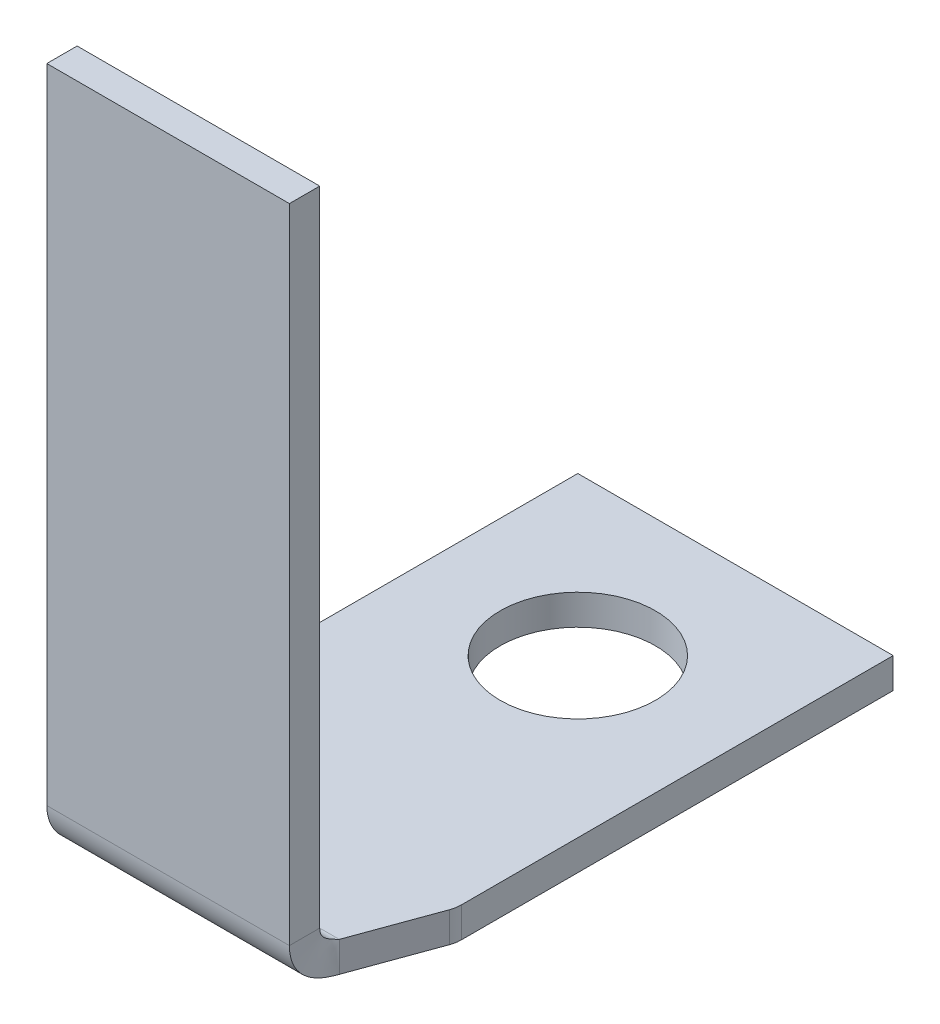
ISO-10303-21;
HEADER;
FILE_DESCRIPTION(('STEP AP214'),'2;1');
FILE_NAME('part.step','',(''),(''),'','','');
FILE_SCHEMA(('AUTOMOTIVE_DESIGN { 1 0 10303 214 1 1 1 1 }'));
ENDSEC;
DATA;
#1=APPLICATION_CONTEXT('core data for automotive mechanical design processes');
#2=APPLICATION_PROTOCOL_DEFINITION('international standard','automotive_design',2000,#1);
#3=PRODUCT_CONTEXT('',#1,'mechanical');
#4=PRODUCT('Part','Part','',(#3));
#5=PRODUCT_RELATED_PRODUCT_CATEGORY('part','',(#4));
#6=PRODUCT_DEFINITION_FORMATION('','',#4);
#7=PRODUCT_DEFINITION_CONTEXT('part definition',#1,'design');
#8=PRODUCT_DEFINITION('design','',#6,#7);
#9=PRODUCT_DEFINITION_SHAPE('','',#8);
#10=(LENGTH_UNIT() NAMED_UNIT(*) SI_UNIT(.MILLI.,.METRE.));
#11=(NAMED_UNIT(*) PLANE_ANGLE_UNIT() SI_UNIT($,.RADIAN.));
#12=(NAMED_UNIT(*) SI_UNIT($,.STERADIAN.) SOLID_ANGLE_UNIT());
#13=UNCERTAINTY_MEASURE_WITH_UNIT(LENGTH_MEASURE(1.E-05),#10,'distance_accuracy_value','');
#14=(GEOMETRIC_REPRESENTATION_CONTEXT(3) GLOBAL_UNCERTAINTY_ASSIGNED_CONTEXT((#13)) GLOBAL_UNIT_ASSIGNED_CONTEXT((#10,
#11,#12)) REPRESENTATION_CONTEXT('',''));
#15=CARTESIAN_POINT('',(0.,0.,0.));
#16=DIRECTION('',(0.,0.,1.));
#17=DIRECTION('',(1.,0.,0.));
#18=AXIS2_PLACEMENT_3D('',#15,#16,#17);
#19=CARTESIAN_POINT('',(-3.81,34.925,-10.4678889681223));
#20=DIRECTION('',(0.93969262078591,0.,-0.342020143325663));
#21=DIRECTION('',(0.342020143325663,0.,0.93969262078591));
#22=AXIS2_PLACEMENT_3D('',#19,#20,#21);
#23=PLANE('',#22);
#24=CARTESIAN_POINT('',(-0.545955351399289,38.1,-1.5));
#25=CARTESIAN_POINT('',(-0.545955351399289,34.925,-1.5));
#26=B_SPLINE_CURVE_WITH_KNOTS('',1,(#24,#25),.UNSPECIFIED.,.F.,.F.,(2,2),(0.,1.),.UNSPECIFIED.);
#27=CARTESIAN_POINT('',(-0.545955351399292,38.1,-1.5));
#28=VERTEX_POINT('',#27);
#29=CARTESIAN_POINT('',(-0.545955351399291,34.925,-1.5));
#30=VERTEX_POINT('',#29);
#31=EDGE_CURVE('E11',#28,#30,#26,.T.);
#32=ORIENTED_EDGE('',*,*,#31,.F.);
#33=DIRECTION('',(0.342020143325663,0.,0.93969262078591));
#34=VECTOR('',#33,1.);
#35=CARTESIAN_POINT('',(-3.81,38.1,-10.4678889681223));
#36=LINE('',#35,#34);
#37=CARTESIAN_POINT('',(-3.61852407099527,38.1,-9.9418131768127));
#38=VERTEX_POINT('',#37);
#39=EDGE_CURVE('E113',#38,#28,#36,.T.);
#40=ORIENTED_EDGE('',*,*,#39,.F.);
#41=DIRECTION('',(0.,-1.,0.));
#42=VECTOR('',#41,1.);
#43=CARTESIAN_POINT('',(-3.61852407099527,34.925,-9.9418131768127));
#44=LINE('',#43,#42);
#45=CARTESIAN_POINT('',(-3.61852407099527,34.925,-9.9418131768127));
#46=VERTEX_POINT('',#45);
#47=EDGE_CURVE('E59',#38,#46,#44,.T.);
#48=ORIENTED_EDGE('',*,*,#47,.T.);
#49=DIRECTION('',(0.342020143325663,0.,0.93969262078591));
#50=VECTOR('',#49,1.);
#51=CARTESIAN_POINT('',(-3.81,34.925,-10.4678889681223));
#52=LINE('',#51,#50);
#53=EDGE_CURVE('E116',#46,#30,#52,.T.);
#54=ORIENTED_EDGE('',*,*,#53,.T.);
#55=EDGE_LOOP('',(#32,#40,#48,#54));
#56=FACE_BOUND('',#55,.T.);
#57=ADVANCED_FACE('F48',(#56),#23,.F.);
#58=CARTESIAN_POINT('',(-0.635,34.925,-11.0277271318717));
#59=DIRECTION('',(0.,-1.,0.));
#60=DIRECTION('',(0.,0.,-1.));
#61=AXIS2_PLACEMENT_3D('',#58,#59,#60);
#62=CYLINDRICAL_SURFACE('',#61,3.175);
#63=ORIENTED_EDGE('',*,*,#47,.F.);
#64=CARTESIAN_POINT('',(-0.635,38.1,-11.0277271318717));
#65=DIRECTION('',(0.,-1.,0.));
#66=DIRECTION('',(0.,0.,-1.));
#67=AXIS2_PLACEMENT_3D('',#64,#65,#66);
#68=CIRCLE('',#67,3.175);
#69=CARTESIAN_POINT('',(-3.81,38.1,-11.0277271318717));
#70=VERTEX_POINT('',#69);
#71=EDGE_CURVE('E147',#38,#70,#68,.T.);
#72=ORIENTED_EDGE('',*,*,#71,.T.);
#73=DIRECTION('',(0.,-1.,0.));
#74=VECTOR('',#73,1.);
#75=CARTESIAN_POINT('',(-3.81,34.925,-11.0277271318717));
#76=LINE('',#75,#74);
#77=CARTESIAN_POINT('',(-3.81,34.925,-11.0277271318717));
#78=VERTEX_POINT('',#77);
#79=EDGE_CURVE('E195',#70,#78,#76,.T.);
#80=ORIENTED_EDGE('',*,*,#79,.T.);
#81=CARTESIAN_POINT('',(-0.635,34.925,-11.0277271318717));
#82=DIRECTION('',(0.,-1.,0.));
#83=DIRECTION('',(0.,0.,-1.));
#84=AXIS2_PLACEMENT_3D('',#81,#82,#83);
#85=CIRCLE('',#84,3.175);
#86=EDGE_CURVE('E374',#46,#78,#85,.T.);
#87=ORIENTED_EDGE('',*,*,#86,.F.);
#88=EDGE_LOOP('',(#63,#72,#80,#87));
#89=FACE_BOUND('',#88,.T.);
#90=ADVANCED_FACE('F453',(#89),#62,.T.);
#91=CARTESIAN_POINT('',(-3.81,34.925,-10.4678889681223));
#92=DIRECTION('',(1.,0.,0.));
#93=DIRECTION('',(0.,0.,1.));
#94=AXIS2_PLACEMENT_3D('',#91,#92,#93);
#95=PLANE('',#94);
#96=ORIENTED_EDGE('',*,*,#79,.F.);
#97=DIRECTION('',(0.,0.,-1.));
#98=VECTOR('',#97,1.);
#99=CARTESIAN_POINT('',(-3.81,38.1,0.));
#100=LINE('',#99,#98);
#101=CARTESIAN_POINT('',(-3.81,38.1,-56.22925));
#102=VERTEX_POINT('',#101);
#103=EDGE_CURVE('E403',#102,#70,#100,.F.);
#104=ORIENTED_EDGE('',*,*,#103,.F.);
#105=DIRECTION('',(0.,-1.,0.));
#106=VECTOR('',#105,1.);
#107=CARTESIAN_POINT('',(-3.81,34.925,-56.22925));
#108=LINE('',#107,#106);
#109=CARTESIAN_POINT('',(-3.81,34.925,-56.22925));
#110=VERTEX_POINT('',#109);
#111=EDGE_CURVE('E198',#102,#110,#108,.T.);
#112=ORIENTED_EDGE('',*,*,#111,.T.);
#113=DIRECTION('',(0.,0.,1.));
#114=VECTOR('',#113,1.);
#115=CARTESIAN_POINT('',(-3.81,34.925,-10.4678889681223));
#116=LINE('',#115,#114);
#117=EDGE_CURVE('E376',#110,#78,#116,.T.);
#118=ORIENTED_EDGE('',*,*,#117,.T.);
#119=EDGE_LOOP('',(#96,#104,#112,#118));
#120=FACE_BOUND('',#119,.T.);
#121=ADVANCED_FACE('F457',(#120),#95,.F.);
#122=CARTESIAN_POINT('',(25.4,34.925,-56.22925));
#123=DIRECTION('',(0.,0.,1.));
#124=DIRECTION('',(-1.,0.,0.));
#125=AXIS2_PLACEMENT_3D('',#122,#123,#124);
#126=PLANE('',#125);
#127=ORIENTED_EDGE('',*,*,#111,.F.);
#128=DIRECTION('',(1.,0.,0.));
#129=VECTOR('',#128,1.);
#130=CARTESIAN_POINT('',(25.4,38.1,-56.22925));
#131=LINE('',#130,#129);
#132=CARTESIAN_POINT('',(29.21,38.1,-56.22925));
#133=VERTEX_POINT('',#132);
#134=EDGE_CURVE('E400',#133,#102,#131,.F.);
#135=ORIENTED_EDGE('',*,*,#134,.F.);
#136=DIRECTION('',(0.,-1.,0.));
#137=VECTOR('',#136,1.);
#138=CARTESIAN_POINT('',(29.21,34.925,-56.22925));
#139=LINE('',#138,#137);
#140=CARTESIAN_POINT('',(29.21,34.925,-56.22925));
#141=VERTEX_POINT('',#140);
#142=EDGE_CURVE('E201',#133,#141,#139,.T.);
#143=ORIENTED_EDGE('',*,*,#142,.T.);
#144=DIRECTION('',(-1.,0.,0.));
#145=VECTOR('',#144,1.);
#146=CARTESIAN_POINT('',(25.4,34.925,-56.22925));
#147=LINE('',#146,#145);
#148=EDGE_CURVE('E385',#141,#110,#147,.T.);
#149=ORIENTED_EDGE('',*,*,#148,.T.);
#150=EDGE_LOOP('',(#127,#135,#143,#149));
#151=FACE_BOUND('',#150,.T.);
#152=ADVANCED_FACE('F462',(#151),#126,.F.);
#153=CARTESIAN_POINT('',(29.21,34.925,-10.4678889681223));
#154=DIRECTION('',(-1.,0.,0.));
#155=DIRECTION('',(0.,0.,-1.));
#156=AXIS2_PLACEMENT_3D('',#153,#154,#155);
#157=PLANE('',#156);
#158=ORIENTED_EDGE('',*,*,#142,.F.);
#159=DIRECTION('',(0.,0.,-1.));
#160=VECTOR('',#159,1.);
#161=CARTESIAN_POINT('',(29.21,38.1,0.));
#162=LINE('',#161,#160);
#163=CARTESIAN_POINT('',(29.21,38.1,-11.0277271318717));
#164=VERTEX_POINT('',#163);
#165=EDGE_CURVE('E397',#164,#133,#162,.T.);
#166=ORIENTED_EDGE('',*,*,#165,.F.);
#167=DIRECTION('',(0.,-1.,0.));
#168=VECTOR('',#167,1.);
#169=CARTESIAN_POINT('',(29.21,34.925,-11.0277271318717));
#170=LINE('',#169,#168);
#171=CARTESIAN_POINT('',(29.21,34.925,-11.0277271318717));
#172=VERTEX_POINT('',#171);
#173=EDGE_CURVE('E204',#164,#172,#170,.T.);
#174=ORIENTED_EDGE('',*,*,#173,.T.);
#175=DIRECTION('',(0.,0.,-1.));
#176=VECTOR('',#175,1.);
#177=CARTESIAN_POINT('',(29.21,34.925,-10.4678889681223));
#178=LINE('',#177,#176);
#179=EDGE_CURVE('E388',#172,#141,#178,.T.);
#180=ORIENTED_EDGE('',*,*,#179,.T.);
#181=EDGE_LOOP('',(#158,#166,#174,#180));
#182=FACE_BOUND('',#181,.T.);
#183=ADVANCED_FACE('F468',(#182),#157,.F.);
#184=CARTESIAN_POINT('',(26.035,34.925,-11.0277271318717));
#185=DIRECTION('',(0.,-1.,0.));
#186=DIRECTION('',(0.,0.,-1.));
#187=AXIS2_PLACEMENT_3D('',#184,#185,#186);
#188=CYLINDRICAL_SURFACE('',#187,3.175);
#189=ORIENTED_EDGE('',*,*,#173,.F.);
#190=CARTESIAN_POINT('',(26.035,38.1,-11.0277271318717));
#191=DIRECTION('',(0.,-1.,0.));
#192=DIRECTION('',(0.,0.,-1.));
#193=AXIS2_PLACEMENT_3D('',#190,#191,#192);
#194=CIRCLE('',#193,3.175);
#195=CARTESIAN_POINT('',(29.0185240709953,38.1,-9.9418131768127));
#196=VERTEX_POINT('',#195);
#197=EDGE_CURVE('E394',#164,#196,#194,.T.);
#198=ORIENTED_EDGE('',*,*,#197,.T.);
#199=DIRECTION('',(0.,-1.,0.));
#200=VECTOR('',#199,1.);
#201=CARTESIAN_POINT('',(29.0185240709953,34.925,-9.9418131768127));
#202=LINE('',#201,#200);
#203=CARTESIAN_POINT('',(29.0185240709953,34.925,-9.9418131768127));
#204=VERTEX_POINT('',#203);
#205=EDGE_CURVE('E207',#196,#204,#202,.T.);
#206=ORIENTED_EDGE('',*,*,#205,.T.);
#207=CARTESIAN_POINT('',(26.035,34.925,-11.0277271318717));
#208=DIRECTION('',(0.,-1.,0.));
#209=DIRECTION('',(0.,0.,-1.));
#210=AXIS2_PLACEMENT_3D('',#207,#208,#209);
#211=CIRCLE('',#210,3.175);
#212=EDGE_CURVE('E292',#172,#204,#211,.T.);
#213=ORIENTED_EDGE('',*,*,#212,.F.);
#214=EDGE_LOOP('',(#189,#198,#206,#213));
#215=FACE_BOUND('',#214,.T.);
#216=ADVANCED_FACE('F471',(#215),#188,.T.);
#217=CARTESIAN_POINT('',(29.21,34.925,-10.4678889681223));
#218=DIRECTION('',(-0.93969262078591,0.,-0.342020143325663));
#219=DIRECTION('',(0.342020143325663,0.,-0.93969262078591));
#220=AXIS2_PLACEMENT_3D('',#217,#218,#219);
#221=PLANE('',#220);
#222=ORIENTED_EDGE('',*,*,#205,.F.);
#223=DIRECTION('',(0.342020143325663,0.,-0.93969262078591));
#224=VECTOR('',#223,1.);
#225=CARTESIAN_POINT('',(29.21,38.1,-10.4678889681223));
#226=LINE('',#225,#224);
#227=CARTESIAN_POINT('',(25.9459553513993,38.1,-1.5));
#228=VERTEX_POINT('',#227);
#229=EDGE_CURVE('E284',#228,#196,#226,.T.);
#230=ORIENTED_EDGE('',*,*,#229,.F.);
#231=CARTESIAN_POINT('',(25.9459553513993,34.925,-1.5));
#232=CARTESIAN_POINT('',(25.9459553513993,38.1,-1.5));
#233=B_SPLINE_CURVE_WITH_KNOTS('',1,(#231,#232),.UNSPECIFIED.,.F.,.F.,(2,2),(0.,1.),.UNSPECIFIED.);
#234=CARTESIAN_POINT('',(25.9459553513993,34.925,-1.5));
#235=VERTEX_POINT('',#234);
#236=EDGE_CURVE('E210',#228,#235,#233,.F.);
#237=ORIENTED_EDGE('',*,*,#236,.T.);
#238=DIRECTION('',(0.342020143325663,0.,-0.93969262078591));
#239=VECTOR('',#238,1.);
#240=CARTESIAN_POINT('',(29.21,34.925,-10.4678889681223));
#241=LINE('',#240,#239);
#242=EDGE_CURVE('E283',#235,#204,#241,.T.);
#243=ORIENTED_EDGE('',*,*,#242,.T.);
#244=EDGE_LOOP('',(#222,#230,#237,#243));
#245=FACE_BOUND('',#244,.T.);
#246=ADVANCED_FACE('F229',(#245),#221,.F.);
#247=CARTESIAN_POINT('',(25.4,39.6,3.175));
#248=CARTESIAN_POINT('',(25.4,39.047896319382,3.175));
#249=CARTESIAN_POINT('',(25.3868525185235,38.4394351454166,3.07223346788879));
#250=CARTESIAN_POINT('',(25.3710449195636,37.2709163694471,2.60214567128804));
#251=CARTESIAN_POINT('',(25.3683848020801,36.7136782095099,2.23457925568205));
#252=CARTESIAN_POINT('',(25.4103342580521,35.8045288503584,1.30576806729753));
#253=CARTESIAN_POINT('',(25.4549438315075,35.4550392587648,0.747401125019789));
#254=CARTESIAN_POINT('',(25.6282149963033,35.0157063350262,-0.397383586008962));
#255=CARTESIAN_POINT('',(25.7571655540302,34.925,-0.981304294705067));
#256=CARTESIAN_POINT('',(25.9459553513993,34.925,-1.5));
#257=CARTESIAN_POINT('',(25.4,39.6,0.));
#258=CARTESIAN_POINT('',(25.4,39.4228544340263,0.));
#259=CARTESIAN_POINT('',(25.3868525185235,39.2276262498663,-0.03297321885921));
#260=CARTESIAN_POINT('',(25.3710449195636,38.8527004393948,-0.183803527928972));
#261=CARTESIAN_POINT('',(25.3683848020801,38.6739074469016,-0.301739276251747));
#262=CARTESIAN_POINT('',(25.4103342580521,38.3822017701685,-0.599753561294909));
#263=CARTESIAN_POINT('',(25.4549438315075,38.270066072331,-0.778908729940175));
#264=CARTESIAN_POINT('',(25.6282149963033,38.1291036369068,-1.14621933240929));
#265=CARTESIAN_POINT('',(25.7570196899802,38.1,-1.33344498498011));
#266=CARTESIAN_POINT('',(25.9459553513993,38.1,-1.5));
#267=B_SPLINE_SURFACE_WITH_KNOTS('',1,3,((#247,#248,#249,#250,#251,#252,#253,#254,#255,#256),
(#257,#258,#259,#260,#261,#262,#263,#264,#265,#266)),.UNSPECIFIED.,.F.,.F.,.F.,(2,2),(4,2,2,2,
4),(0.,1.),(0.,0.25,0.5,0.75,1.),.UNSPECIFIED.);
#268=CARTESIAN_POINT('',(25.9459553513993,38.1,-1.5));
#269=CARTESIAN_POINT('',(25.7570196899802,38.1,-1.33344498498011));
#270=CARTESIAN_POINT('',(25.6282149963033,38.1291036369068,-1.14621933240929));
#271=CARTESIAN_POINT('',(25.4549438315075,38.270066072331,-0.778908729940175));
#272=CARTESIAN_POINT('',(25.4103342580521,38.3822017701685,-0.599753561294909));
#273=CARTESIAN_POINT('',(25.3683848020801,38.6739074469016,-0.301739276251747));
#274=CARTESIAN_POINT('',(25.3710449195636,38.8527004393948,-0.183803527928972));
#275=CARTESIAN_POINT('',(25.3868525185235,39.2276262498663,-0.03297321885921));
#276=CARTESIAN_POINT('',(25.4,39.4228544340263,0.));
#277=CARTESIAN_POINT('',(25.4,39.6,0.));
#278=B_SPLINE_CURVE_WITH_KNOTS('',3,(#268,#269,#270,#271,#272,#273,#274,#275,#276,#277),
.UNSPECIFIED.,.F.,.F.,(4,2,2,2,4),(0.,0.25,0.5,0.75,1.),.UNSPECIFIED.);
#279=CARTESIAN_POINT('',(25.4,39.6,0.));
#280=VERTEX_POINT('',#279);
#281=EDGE_CURVE('E135',#228,#280,#278,.T.);
#282=CARTESIAN_POINT('',(25.4,39.6,0.));
#283=CARTESIAN_POINT('',(25.4,39.6,3.175));
#284=B_SPLINE_CURVE_WITH_KNOTS('',1,(#282,#283),.UNSPECIFIED.,.F.,.F.,(2,2),(0.,1.),.UNSPECIFIED.);
#285=CARTESIAN_POINT('',(25.4,39.6,3.175));
#286=VERTEX_POINT('',#285);
#287=EDGE_CURVE('E67',#280,#286,#284,.T.);
#288=CARTESIAN_POINT('',(25.4,39.6,3.175));
#289=CARTESIAN_POINT('',(25.4,39.047896319382,3.175));
#290=CARTESIAN_POINT('',(25.3868525185235,38.4394351454166,3.07223346788879));
#291=CARTESIAN_POINT('',(25.3710449195636,37.2709163694471,2.60214567128804));
#292=CARTESIAN_POINT('',(25.3683848020801,36.7136782095099,2.23457925568205));
#293=CARTESIAN_POINT('',(25.4103342580521,35.8045288503584,1.30576806729753));
#294=CARTESIAN_POINT('',(25.4549438315075,35.4550392587648,0.747401125019789));
#295=CARTESIAN_POINT('',(25.6282149963033,35.0157063350262,-0.397383586008962));
#296=CARTESIAN_POINT('',(25.7571655540302,34.925,-0.981304294705067));
#297=CARTESIAN_POINT('',(25.9459553513993,34.925,-1.5));
#298=B_SPLINE_CURVE_WITH_KNOTS('',3,(#288,#289,#290,#291,#292,#293,#294,#295,#296,#297),
.UNSPECIFIED.,.F.,.F.,(4,2,2,2,4),(0.,0.25,0.5,0.75,1.),.UNSPECIFIED.);
#299=EDGE_CURVE('E295',#235,#286,#298,.F.);
#300=ORIENTED_EDGE('',*,*,#236,.F.);
#301=ORIENTED_EDGE('',*,*,#281,.T.);
#302=ORIENTED_EDGE('',*,*,#287,.T.);
#303=ORIENTED_EDGE('',*,*,#299,.F.);
#304=EDGE_LOOP('',(#300,#301,#302,#303));
#305=FACE_BOUND('',#304,.T.);
#306=ADVANCED_FACE('F216',(#305),#267,.F.);
#307=CARTESIAN_POINT('',(25.4,0.,3.175));
#308=DIRECTION('',(1.,0.,0.));
#309=DIRECTION('',(0.,1.,0.));
#310=AXIS2_PLACEMENT_3D('',#307,#308,#309);
#311=PLANE('',#310);
#312=ORIENTED_EDGE('',*,*,#287,.F.);
#313=DIRECTION('',(0.,-1.,0.));
#314=VECTOR('',#313,1.);
#315=CARTESIAN_POINT('',(25.4,0.,0.));
#316=LINE('',#315,#314);
#317=CARTESIAN_POINT('',(25.4,106.879486367274,0.));
#318=VERTEX_POINT('',#317);
#319=EDGE_CURVE('E348',#280,#318,#316,.F.);
#320=ORIENTED_EDGE('',*,*,#319,.T.);
#321=DIRECTION('',(0.,0.,1.));
#322=VECTOR('',#321,1.);
#323=CARTESIAN_POINT('',(25.4,106.879486367274,3.175));
#324=LINE('',#323,#322);
#325=CARTESIAN_POINT('',(25.4,106.879486367274,3.175));
#326=VERTEX_POINT('',#325);
#327=EDGE_CURVE('E428',#318,#326,#324,.T.);
#328=ORIENTED_EDGE('',*,*,#327,.T.);
#329=DIRECTION('',(0.,1.,0.));
#330=VECTOR('',#329,1.);
#331=CARTESIAN_POINT('',(25.4,0.,3.175));
#332=LINE('',#331,#330);
#333=EDGE_CURVE('E310',#286,#326,#332,.T.);
#334=ORIENTED_EDGE('',*,*,#333,.F.);
#335=EDGE_LOOP('',(#312,#320,#328,#334));
#336=FACE_BOUND('',#335,.T.);
#337=ADVANCED_FACE('F228',(#336),#311,.T.);
#338=CARTESIAN_POINT('',(25.4,106.879486367274,3.175));
#339=DIRECTION('',(0.,1.,0.));
#340=DIRECTION('',(-1.,0.,0.));
#341=AXIS2_PLACEMENT_3D('',#338,#339,#340);
#342=PLANE('',#341);
#343=ORIENTED_EDGE('',*,*,#327,.F.);
#344=DIRECTION('',(1.,0.,0.));
#345=VECTOR('',#344,1.);
#346=CARTESIAN_POINT('',(25.4,106.879486367274,0.));
#347=LINE('',#346,#345);
#348=CARTESIAN_POINT('',(0.,106.879486367274,0.));
#349=VERTEX_POINT('',#348);
#350=EDGE_CURVE('E141',#318,#349,#347,.F.);
#351=ORIENTED_EDGE('',*,*,#350,.T.);
#352=DIRECTION('',(0.,0.,1.));
#353=VECTOR('',#352,1.);
#354=CARTESIAN_POINT('',(0.,106.879486367274,3.175));
#355=LINE('',#354,#353);
#356=CARTESIAN_POINT('',(0.,106.879486367274,3.175));
#357=VERTEX_POINT('',#356);
#358=EDGE_CURVE('E163',#349,#357,#355,.T.);
#359=ORIENTED_EDGE('',*,*,#358,.T.);
#360=DIRECTION('',(-1.,0.,0.));
#361=VECTOR('',#360,1.);
#362=CARTESIAN_POINT('',(25.4,106.879486367274,3.175));
#363=LINE('',#362,#361);
#364=EDGE_CURVE('E305',#326,#357,#363,.T.);
#365=ORIENTED_EDGE('',*,*,#364,.F.);
#366=EDGE_LOOP('',(#343,#351,#359,#365));
#367=FACE_BOUND('',#366,.T.);
#368=ADVANCED_FACE('F432',(#367),#342,.T.);
#369=CARTESIAN_POINT('',(0.,0.,3.175));
#370=DIRECTION('',(1.,0.,0.));
#371=DIRECTION('',(0.,1.,0.));
#372=AXIS2_PLACEMENT_3D('',#369,#370,#371);
#373=PLANE('',#372);
#374=ORIENTED_EDGE('',*,*,#358,.F.);
#375=DIRECTION('',(0.,-1.,0.));
#376=VECTOR('',#375,1.);
#377=CARTESIAN_POINT('',(0.,0.,0.));
#378=LINE('',#377,#376);
#379=CARTESIAN_POINT('',(0.,39.6,0.));
#380=VERTEX_POINT('',#379);
#381=EDGE_CURVE('E340',#380,#349,#378,.F.);
#382=ORIENTED_EDGE('',*,*,#381,.F.);
#383=CARTESIAN_POINT('',(0.,39.6,3.175));
#384=CARTESIAN_POINT('',(0.,39.6,0.));
#385=B_SPLINE_CURVE_WITH_KNOTS('',1,(#383,#384),.UNSPECIFIED.,.F.,.F.,(2,2),(0.,1.),.UNSPECIFIED.);
#386=CARTESIAN_POINT('',(0.,39.6,3.175));
#387=VERTEX_POINT('',#386);
#388=EDGE_CURVE('E153',#380,#387,#385,.F.);
#389=ORIENTED_EDGE('',*,*,#388,.T.);
#390=DIRECTION('',(0.,1.,0.));
#391=VECTOR('',#390,1.);
#392=CARTESIAN_POINT('',(0.,0.,3.175));
#393=LINE('',#392,#391);
#394=EDGE_CURVE('E293',#387,#357,#393,.T.);
#395=ORIENTED_EDGE('',*,*,#394,.T.);
#396=EDGE_LOOP('',(#374,#382,#389,#395));
#397=FACE_BOUND('',#396,.T.);
#398=ADVANCED_FACE('F434',(#397),#373,.F.);
#399=CARTESIAN_POINT('',(12.7,34.925,-39.71925));
#400=DIRECTION('',(0.,-1.,0.));
#401=DIRECTION('',(0.,0.,-1.));
#402=AXIS2_PLACEMENT_3D('',#399,#400,#401);
#403=CYLINDRICAL_SURFACE('',#402,8.128);
#404=CARTESIAN_POINT('',(12.7,34.925,-39.71925));
#405=DIRECTION('',(0.,1.,0.));
#406=DIRECTION('',(0.,0.,1.));
#407=AXIS2_PLACEMENT_3D('',#404,#405,#406);
#408=CIRCLE('',#407,8.128);
#409=CARTESIAN_POINT('',(12.7,34.925,-31.59125));
#410=VERTEX_POINT('',#409);
#411=EDGE_CURVE('E299',#410,#410,#408,.T.);
#412=ORIENTED_EDGE('',*,*,#411,.F.);
#413=EDGE_LOOP('',(#412));
#414=FACE_BOUND('',#413,.T.);
#415=CARTESIAN_POINT('',(12.7,38.1,-39.71925));
#416=DIRECTION('',(0.,1.,0.));
#417=DIRECTION('',(0.,0.,1.));
#418=AXIS2_PLACEMENT_3D('',#415,#416,#417);
#419=CIRCLE('',#418,8.128);
#420=CARTESIAN_POINT('',(12.7,38.1,-31.59125));
#421=VERTEX_POINT('',#420);
#422=EDGE_CURVE('E148',#421,#421,#419,.T.);
#423=ORIENTED_EDGE('',*,*,#422,.T.);
#424=EDGE_LOOP('',(#423));
#425=FACE_BOUND('',#424,.T.);
#426=ADVANCED_FACE('F50',(#414,#425),#403,.F.);
#427=CARTESIAN_POINT('',(-0.545955351399289,34.925,-1.5));
#428=CARTESIAN_POINT('',(-0.357165554030222,34.925,-0.981304294705066));
#429=CARTESIAN_POINT('',(-0.228214996303266,35.0157063350262,-0.39738358600896));
#430=CARTESIAN_POINT('',(-0.0549438315075035,35.4550392587648,0.747401125019789));
#431=CARTESIAN_POINT('',(-0.0103342580520544,35.8045288503584,1.30576806729753));
#432=CARTESIAN_POINT('',(0.0316151979199101,36.7136782095099,2.23457925568205));
#433=CARTESIAN_POINT('',(0.0289550804364278,37.2709163694471,2.60214567128804));
#434=CARTESIAN_POINT('',(0.0131474814764725,38.4394351454166,3.07223346788879));
#435=CARTESIAN_POINT('',(0.,39.047896319382,3.175));
#436=CARTESIAN_POINT('',(0.,39.6,3.175));
#437=CARTESIAN_POINT('',(-0.545955351399289,38.1,-1.5));
#438=CARTESIAN_POINT('',(-0.357019689980204,38.1,-1.33344498498011));
#439=CARTESIAN_POINT('',(-0.228214996303266,38.1291036369068,-1.14621933240929));
#440=CARTESIAN_POINT('',(-0.0549438315075035,38.270066072331,-0.778908729940175));
#441=CARTESIAN_POINT('',(-0.0103342580520544,38.3822017701685,-0.59975356129491));
#442=CARTESIAN_POINT('',(0.0316151979199101,38.6739074469016,-0.301739276251747));
#443=CARTESIAN_POINT('',(0.0289550804364278,38.8527004393948,-0.183803527928971));
#444=CARTESIAN_POINT('',(0.0131474814764725,39.2276262498663,-0.0329732188592103));
#445=CARTESIAN_POINT('',(0.,39.4228544340263,0.));
#446=CARTESIAN_POINT('',(0.,39.6,0.));
#447=B_SPLINE_SURFACE_WITH_KNOTS('',1,3,((#427,#428,#429,#430,#431,#432,#433,#434,#435,#436),
(#437,#438,#439,#440,#441,#442,#443,#444,#445,#446)),.UNSPECIFIED.,.F.,.F.,.F.,(2,2),(4,2,2,2,
4),(0.,1.),(0.,0.25,0.5,0.75,1.),.UNSPECIFIED.);
#448=CARTESIAN_POINT('',(0.,39.6,0.));
#449=CARTESIAN_POINT('',(0.,39.4228544340263,0.));
#450=CARTESIAN_POINT('',(0.0131474814764725,39.2276262498663,-0.0329732188592103));
#451=CARTESIAN_POINT('',(0.0289550804364278,38.8527004393948,-0.183803527928971));
#452=CARTESIAN_POINT('',(0.0316151979199101,38.6739074469016,-0.301739276251747));
#453=CARTESIAN_POINT('',(-0.0103342580520544,38.3822017701685,-0.59975356129491));
#454=CARTESIAN_POINT('',(-0.0549438315075035,38.270066072331,-0.778908729940175));
#455=CARTESIAN_POINT('',(-0.228214996303266,38.1291036369068,-1.14621933240929));
#456=CARTESIAN_POINT('',(-0.357019689980204,38.1,-1.33344498498011));
#457=CARTESIAN_POINT('',(-0.545955351399289,38.1,-1.5));
#458=B_SPLINE_CURVE_WITH_KNOTS('',3,(#448,#449,#450,#451,#452,#453,#454,#455,#456,#457),
.UNSPECIFIED.,.F.,.F.,(4,2,2,2,4),(0.,0.25,0.5,0.75,1.),.UNSPECIFIED.);
#459=EDGE_CURVE('E132',#380,#28,#458,.T.);
#460=CARTESIAN_POINT('',(-0.545955351399289,34.925,-1.5));
#461=CARTESIAN_POINT('',(-0.357165554030222,34.925,-0.981304294705066));
#462=CARTESIAN_POINT('',(-0.228214996303266,35.0157063350262,-0.39738358600896));
#463=CARTESIAN_POINT('',(-0.0549438315075035,35.4550392587648,0.747401125019789));
#464=CARTESIAN_POINT('',(-0.0103342580520544,35.8045288503584,1.30576806729753));
#465=CARTESIAN_POINT('',(0.0316151979199101,36.7136782095099,2.23457925568205));
#466=CARTESIAN_POINT('',(0.0289550804364278,37.2709163694471,2.60214567128804));
#467=CARTESIAN_POINT('',(0.0131474814764725,38.4394351454166,3.07223346788879));
#468=CARTESIAN_POINT('',(0.,39.047896319382,3.175));
#469=CARTESIAN_POINT('',(0.,39.6,3.175));
#470=B_SPLINE_CURVE_WITH_KNOTS('',3,(#460,#461,#462,#463,#464,#465,#466,#467,#468,#469),
.UNSPECIFIED.,.F.,.F.,(4,2,2,2,4),(0.,0.25,0.5,0.75,1.),.UNSPECIFIED.);
#471=EDGE_CURVE('E300',#387,#30,#470,.F.);
#472=ORIENTED_EDGE('',*,*,#459,.T.);
#473=ORIENTED_EDGE('',*,*,#31,.T.);
#474=ORIENTED_EDGE('',*,*,#471,.F.);
#475=ORIENTED_EDGE('',*,*,#388,.F.);
#476=EDGE_LOOP('',(#472,#473,#474,#475));
#477=FACE_BOUND('',#476,.T.);
#478=ADVANCED_FACE('F152',(#477),#447,.F.);
#479=CARTESIAN_POINT('',(25.4,0.,3.175));
#480=DIRECTION('',(0.,0.,1.));
#481=DIRECTION('',(0.,-1.,0.));
#482=AXIS2_PLACEMENT_3D('',#479,#480,#481);
#483=PLANE('',#482);
#484=ORIENTED_EDGE('',*,*,#394,.F.);
#485=DIRECTION('',(-1.,0.,0.));
#486=VECTOR('',#485,1.);
#487=CARTESIAN_POINT('',(25.4,39.6,3.175));
#488=LINE('',#487,#486);
#489=EDGE_CURVE('E304',#387,#286,#488,.F.);
#490=ORIENTED_EDGE('',*,*,#489,.T.);
#491=ORIENTED_EDGE('',*,*,#333,.T.);
#492=ORIENTED_EDGE('',*,*,#364,.T.);
#493=EDGE_LOOP('',(#484,#490,#491,#492));
#494=FACE_BOUND('',#493,.T.);
#495=ADVANCED_FACE('F175',(#494),#483,.T.);
#496=CARTESIAN_POINT('',(25.4,34.925,0.));
#497=DIRECTION('',(0.,-1.,0.));
#498=DIRECTION('',(0.,0.,-1.));
#499=AXIS2_PLACEMENT_3D('',#496,#497,#498);
#500=PLANE('',#499);
#501=ORIENTED_EDGE('',*,*,#411,.T.);
#502=EDGE_LOOP('',(#501));
#503=FACE_BOUND('',#502,.T.);
#504=ORIENTED_EDGE('',*,*,#242,.F.);
#505=DIRECTION('',(-1.,0.,0.));
#506=VECTOR('',#505,1.);
#507=CARTESIAN_POINT('',(25.4,34.925,-1.5));
#508=LINE('',#507,#506);
#509=EDGE_CURVE('E289',#235,#30,#508,.T.);
#510=ORIENTED_EDGE('',*,*,#509,.T.);
#511=ORIENTED_EDGE('',*,*,#53,.F.);
#512=ORIENTED_EDGE('',*,*,#86,.T.);
#513=ORIENTED_EDGE('',*,*,#117,.F.);
#514=ORIENTED_EDGE('',*,*,#148,.F.);
#515=ORIENTED_EDGE('',*,*,#179,.F.);
#516=ORIENTED_EDGE('',*,*,#212,.T.);
#517=EDGE_LOOP('',(#504,#510,#511,#512,#513,#514,#515,#516));
#518=FACE_BOUND('',#517,.T.);
#519=ADVANCED_FACE('F287',(#503,#518),#500,.T.);
#520=CARTESIAN_POINT('',(25.4,39.6,-1.5));
#521=DIRECTION('',(-1.,0.,0.));
#522=DIRECTION('',(0.,0.,1.));
#523=AXIS2_PLACEMENT_3D('',#520,#521,#522);
#524=CYLINDRICAL_SURFACE('',#523,4.675);
#525=ORIENTED_EDGE('',*,*,#299,.T.);
#526=ORIENTED_EDGE('',*,*,#489,.F.);
#527=ORIENTED_EDGE('',*,*,#471,.T.);
#528=ORIENTED_EDGE('',*,*,#509,.F.);
#529=EDGE_LOOP('',(#525,#526,#527,#528));
#530=FACE_BOUND('',#529,.T.);
#531=ADVANCED_FACE('F302',(#530),#524,.T.);
#532=CARTESIAN_POINT('',(25.4,0.,0.));
#533=DIRECTION('',(0.,0.,1.));
#534=DIRECTION('',(0.,-1.,0.));
#535=AXIS2_PLACEMENT_3D('',#532,#533,#534);
#536=PLANE('',#535);
#537=ORIENTED_EDGE('',*,*,#381,.T.);
#538=ORIENTED_EDGE('',*,*,#350,.F.);
#539=ORIENTED_EDGE('',*,*,#319,.F.);
#540=DIRECTION('',(1.,0.,0.));
#541=VECTOR('',#540,1.);
#542=CARTESIAN_POINT('',(25.4,39.6,0.));
#543=LINE('',#542,#541);
#544=EDGE_CURVE('E140',#380,#280,#543,.T.);
#545=ORIENTED_EDGE('',*,*,#544,.F.);
#546=EDGE_LOOP('',(#537,#538,#539,#545));
#547=FACE_BOUND('',#546,.T.);
#548=ADVANCED_FACE('F332',(#547),#536,.F.);
#549=CARTESIAN_POINT('',(25.4,38.1,0.));
#550=DIRECTION('',(0.,-1.,0.));
#551=DIRECTION('',(0.,0.,-1.));
#552=AXIS2_PLACEMENT_3D('',#549,#550,#551);
#553=PLANE('',#552);
#554=ORIENTED_EDGE('',*,*,#422,.F.);
#555=EDGE_LOOP('',(#554));
#556=FACE_BOUND('',#555,.T.);
#557=ORIENTED_EDGE('',*,*,#229,.T.);
#558=ORIENTED_EDGE('',*,*,#197,.F.);
#559=ORIENTED_EDGE('',*,*,#165,.T.);
#560=ORIENTED_EDGE('',*,*,#134,.T.);
#561=ORIENTED_EDGE('',*,*,#103,.T.);
#562=ORIENTED_EDGE('',*,*,#71,.F.);
#563=ORIENTED_EDGE('',*,*,#39,.T.);
#564=DIRECTION('',(1.,0.,0.));
#565=VECTOR('',#564,1.);
#566=CARTESIAN_POINT('',(25.4,38.1,-1.5));
#567=LINE('',#566,#565);
#568=EDGE_CURVE('E129',#228,#28,#567,.F.);
#569=ORIENTED_EDGE('',*,*,#568,.F.);
#570=EDGE_LOOP('',(#557,#558,#559,#560,#561,#562,#563,#569));
#571=FACE_BOUND('',#570,.T.);
#572=ADVANCED_FACE('F144',(#556,#571),#553,.F.);
#573=CARTESIAN_POINT('',(25.4,39.6,-1.5));
#574=DIRECTION('',(-1.,0.,0.));
#575=DIRECTION('',(0.,0.,1.));
#576=AXIS2_PLACEMENT_3D('',#573,#574,#575);
#577=CYLINDRICAL_SURFACE('',#576,1.5);
#578=ORIENTED_EDGE('',*,*,#281,.F.);
#579=ORIENTED_EDGE('',*,*,#568,.T.);
#580=ORIENTED_EDGE('',*,*,#459,.F.);
#581=ORIENTED_EDGE('',*,*,#544,.T.);
#582=EDGE_LOOP('',(#578,#579,#580,#581));
#583=FACE_BOUND('',#582,.T.);
#584=ADVANCED_FACE('F130',(#583),#577,.F.);
#585=CLOSED_SHELL('',(#57,#90,#121,#152,#183,#216,#246,#306,#337,#368,#398,#426,#478,#495,#519,
#531,#548,#572,#584));
#586=MANIFOLD_SOLID_BREP('B2',#585);
#587=ADVANCED_BREP_SHAPE_REPRESENTATION('',(#18,#586),#14);
#588=SHAPE_DEFINITION_REPRESENTATION(#9,#587);
ENDSEC;
END-ISO-10303-21;
